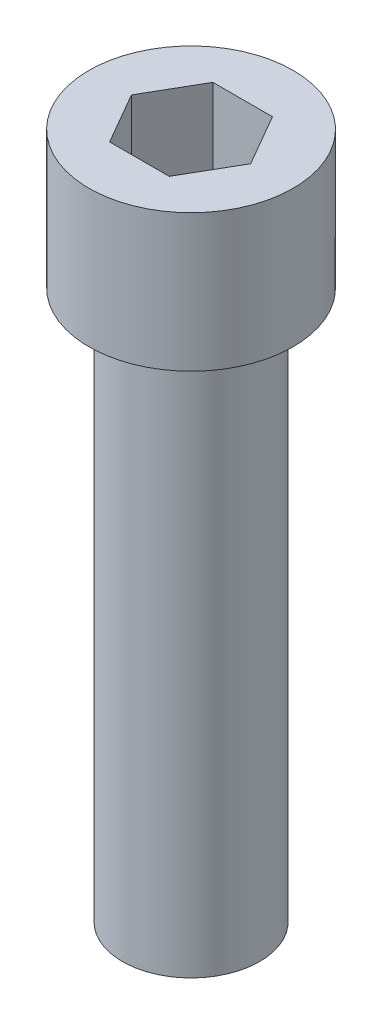
ISO-10303-21;
HEADER;
FILE_DESCRIPTION(('STEP AP214'),'2;1');
FILE_NAME('part.step','',(''),(''),'','','');
FILE_SCHEMA(('AUTOMOTIVE_DESIGN { 1 0 10303 214 1 1 1 1 }'));
ENDSEC;
DATA;
#1=APPLICATION_CONTEXT('core data for automotive mechanical design processes');
#2=APPLICATION_PROTOCOL_DEFINITION('international standard','automotive_design',2000,#1);
#3=PRODUCT_CONTEXT('',#1,'mechanical');
#4=PRODUCT('Part','Part','',(#3));
#5=PRODUCT_RELATED_PRODUCT_CATEGORY('part','',(#4));
#6=PRODUCT_DEFINITION_FORMATION('','',#4);
#7=PRODUCT_DEFINITION_CONTEXT('part definition',#1,'design');
#8=PRODUCT_DEFINITION('design','',#6,#7);
#9=PRODUCT_DEFINITION_SHAPE('','',#8);
#10=(LENGTH_UNIT() NAMED_UNIT(*) SI_UNIT(.MILLI.,.METRE.));
#11=(NAMED_UNIT(*) PLANE_ANGLE_UNIT() SI_UNIT($,.RADIAN.));
#12=(NAMED_UNIT(*) SI_UNIT($,.STERADIAN.) SOLID_ANGLE_UNIT());
#13=UNCERTAINTY_MEASURE_WITH_UNIT(LENGTH_MEASURE(1.E-05),#10,'distance_accuracy_value','');
#14=(GEOMETRIC_REPRESENTATION_CONTEXT(3) GLOBAL_UNCERTAINTY_ASSIGNED_CONTEXT((#13)) GLOBAL_UNIT_ASSIGNED_CONTEXT((#10,
#11,#12)) REPRESENTATION_CONTEXT('',''));
#15=CARTESIAN_POINT('',(0.,0.,0.));
#16=DIRECTION('',(0.,0.,1.));
#17=DIRECTION('',(1.,0.,0.));
#18=AXIS2_PLACEMENT_3D('',#15,#16,#17);
#19=CARTESIAN_POINT('',(0.,31.75,0.));
#20=DIRECTION('',(0.,1.,0.));
#21=DIRECTION('',(0.,0.,1.));
#22=AXIS2_PLACEMENT_3D('',#19,#20,#21);
#23=PLANE('',#22);
#24=DIRECTION('',(0.5,0.,-0.866025403784439));
#25=VECTOR('',#24,1.);
#26=CARTESIAN_POINT('',(1.37848150271715,31.75,2.3876));
#27=LINE('',#26,#25);
#28=CARTESIAN_POINT('',(1.37848150271715,31.75,2.3876));
#29=VERTEX_POINT('',#28);
#30=CARTESIAN_POINT('',(2.7569630054343,31.75,0.));
#31=VERTEX_POINT('',#30);
#32=EDGE_CURVE('E47',#29,#31,#27,.T.);
#33=ORIENTED_EDGE('',*,*,#32,.F.);
#34=DIRECTION('',(1.,0.,0.));
#35=VECTOR('',#34,1.);
#36=CARTESIAN_POINT('',(-1.37848150271715,31.75,2.3876));
#37=LINE('',#36,#35);
#38=CARTESIAN_POINT('',(-1.37848150271715,31.75,2.3876));
#39=VERTEX_POINT('',#38);
#40=EDGE_CURVE('E116',#39,#29,#37,.T.);
#41=ORIENTED_EDGE('',*,*,#40,.F.);
#42=DIRECTION('',(0.5,0.,0.866025403784438));
#43=VECTOR('',#42,1.);
#44=CARTESIAN_POINT('',(-2.7569630054343,31.75,0.));
#45=LINE('',#44,#43);
#46=CARTESIAN_POINT('',(-2.7569630054343,31.75,0.));
#47=VERTEX_POINT('',#46);
#48=EDGE_CURVE('E110',#47,#39,#45,.T.);
#49=ORIENTED_EDGE('',*,*,#48,.F.);
#50=DIRECTION('',(-0.5,0.,0.866025403784439));
#51=VECTOR('',#50,1.);
#52=CARTESIAN_POINT('',(-1.37848150271715,31.75,-2.3876));
#53=LINE('',#52,#51);
#54=CARTESIAN_POINT('',(-1.37848150271715,31.75,-2.3876));
#55=VERTEX_POINT('',#54);
#56=EDGE_CURVE('E108',#55,#47,#53,.T.);
#57=ORIENTED_EDGE('',*,*,#56,.F.);
#58=DIRECTION('',(-1.,0.,0.));
#59=VECTOR('',#58,1.);
#60=CARTESIAN_POINT('',(1.37848150271715,31.75,-2.3876));
#61=LINE('',#60,#59);
#62=CARTESIAN_POINT('',(1.37848150271715,31.75,-2.3876));
#63=VERTEX_POINT('',#62);
#64=EDGE_CURVE('E90',#63,#55,#61,.T.);
#65=ORIENTED_EDGE('',*,*,#64,.F.);
#66=DIRECTION('',(-0.5,0.,-0.866025403784439));
#67=VECTOR('',#66,1.);
#68=CARTESIAN_POINT('',(2.7569630054343,31.75,0.));
#69=LINE('',#68,#67);
#70=EDGE_CURVE('E101',#31,#63,#69,.T.);
#71=ORIENTED_EDGE('',*,*,#70,.F.);
#72=EDGE_LOOP('',(#33,#41,#49,#57,#65,#71));
#73=FACE_BOUND('',#72,.T.);
#74=CARTESIAN_POINT('',(0.,31.75,0.));
#75=DIRECTION('',(0.,-1.,0.));
#76=DIRECTION('',(0.,0.,-1.));
#77=AXIS2_PLACEMENT_3D('',#74,#75,#76);
#78=CIRCLE('',#77,4.7244);
#79=CARTESIAN_POINT('',(0.,31.75,-4.7244));
#80=VERTEX_POINT('',#79);
#81=EDGE_CURVE('E11',#80,#80,#78,.T.);
#82=ORIENTED_EDGE('',*,*,#81,.F.);
#83=EDGE_LOOP('',(#82));
#84=FACE_BOUND('',#83,.T.);
#85=ADVANCED_FACE('F33',(#73,#84),#23,.T.);
#86=CARTESIAN_POINT('',(0.,0.,0.));
#87=DIRECTION('',(0.,-1.,0.));
#88=DIRECTION('',(0.,0.,-1.));
#89=AXIS2_PLACEMENT_3D('',#86,#87,#88);
#90=CYLINDRICAL_SURFACE('',#89,4.7244);
#91=ORIENTED_EDGE('',*,*,#81,.T.);
#92=EDGE_LOOP('',(#91));
#93=FACE_BOUND('',#92,.T.);
#94=CARTESIAN_POINT('',(0.,25.4,0.));
#95=DIRECTION('',(0.,-1.,0.));
#96=DIRECTION('',(0.,0.,-1.));
#97=AXIS2_PLACEMENT_3D('',#94,#95,#96);
#98=CIRCLE('',#97,4.7244);
#99=CARTESIAN_POINT('',(0.,25.4,-4.7244));
#100=VERTEX_POINT('',#99);
#101=EDGE_CURVE('E40',#100,#100,#98,.T.);
#102=ORIENTED_EDGE('',*,*,#101,.F.);
#103=EDGE_LOOP('',(#102));
#104=FACE_BOUND('',#103,.T.);
#105=ADVANCED_FACE('F151',(#93,#104),#90,.T.);
#106=CARTESIAN_POINT('',(3.175,25.4,0.));
#107=DIRECTION('',(0.,-1.,0.));
#108=DIRECTION('',(0.,0.,-1.));
#109=AXIS2_PLACEMENT_3D('',#106,#107,#108);
#110=PLANE('',#109);
#111=ORIENTED_EDGE('',*,*,#101,.T.);
#112=EDGE_LOOP('',(#111));
#113=FACE_BOUND('',#112,.T.);
#114=CARTESIAN_POINT('',(0.,25.4,0.));
#115=DIRECTION('',(0.,-1.,0.));
#116=DIRECTION('',(0.,0.,-1.));
#117=AXIS2_PLACEMENT_3D('',#114,#115,#116);
#118=CIRCLE('',#117,3.175);
#119=CARTESIAN_POINT('',(0.,25.4,-3.175));
#120=VERTEX_POINT('',#119);
#121=EDGE_CURVE('E143',#120,#120,#118,.T.);
#122=ORIENTED_EDGE('',*,*,#121,.F.);
#123=EDGE_LOOP('',(#122));
#124=FACE_BOUND('',#123,.T.);
#125=ADVANCED_FACE('F148',(#113,#124),#110,.T.);
#126=CARTESIAN_POINT('',(0.,0.,0.));
#127=DIRECTION('',(0.,-1.,0.));
#128=DIRECTION('',(0.,0.,-1.));
#129=AXIS2_PLACEMENT_3D('',#126,#127,#128);
#130=CYLINDRICAL_SURFACE('',#129,3.175);
#131=ORIENTED_EDGE('',*,*,#121,.T.);
#132=EDGE_LOOP('',(#131));
#133=FACE_BOUND('',#132,.T.);
#134=CARTESIAN_POINT('',(0.,0.,0.));
#135=DIRECTION('',(0.,-1.,0.));
#136=DIRECTION('',(0.,0.,-1.));
#137=AXIS2_PLACEMENT_3D('',#134,#135,#136);
#138=CIRCLE('',#137,3.175);
#139=CARTESIAN_POINT('',(0.,0.,-3.175));
#140=VERTEX_POINT('',#139);
#141=EDGE_CURVE('E134',#140,#140,#138,.T.);
#142=ORIENTED_EDGE('',*,*,#141,.F.);
#143=EDGE_LOOP('',(#142));
#144=FACE_BOUND('',#143,.T.);
#145=ADVANCED_FACE('F158',(#133,#144),#130,.T.);
#146=CARTESIAN_POINT('',(0.,0.,0.));
#147=DIRECTION('',(0.,-1.,0.));
#148=DIRECTION('',(0.,0.,-1.));
#149=AXIS2_PLACEMENT_3D('',#146,#147,#148);
#150=PLANE('',#149);
#151=ORIENTED_EDGE('',*,*,#141,.T.);
#152=EDGE_LOOP('',(#151));
#153=FACE_BOUND('',#152,.T.);
#154=ADVANCED_FACE('F163',(#153),#150,.T.);
#155=CARTESIAN_POINT('',(1.37848150271715,27.94,2.3876));
#156=DIRECTION('',(0.866025403784439,0.,0.5));
#157=DIRECTION('',(0.5,0.,-0.866025403784439));
#158=AXIS2_PLACEMENT_3D('',#155,#156,#157);
#159=PLANE('',#158);
#160=ORIENTED_EDGE('',*,*,#32,.T.);
#161=DIRECTION('',(0.,1.,0.));
#162=VECTOR('',#161,1.);
#163=CARTESIAN_POINT('',(2.7569630054343,27.94,0.));
#164=LINE('',#163,#162);
#165=CARTESIAN_POINT('',(2.7569630054343,27.94,0.));
#166=VERTEX_POINT('',#165);
#167=EDGE_CURVE('E98',#166,#31,#164,.T.);
#168=ORIENTED_EDGE('',*,*,#167,.F.);
#169=DIRECTION('',(0.5,0.,-0.866025403784439));
#170=VECTOR('',#169,1.);
#171=CARTESIAN_POINT('',(1.37848150271715,27.94,2.3876));
#172=LINE('',#171,#170);
#173=CARTESIAN_POINT('',(1.37848150271715,27.94,2.3876));
#174=VERTEX_POINT('',#173);
#175=EDGE_CURVE('E118',#174,#166,#172,.T.);
#176=ORIENTED_EDGE('',*,*,#175,.F.);
#177=DIRECTION('',(0.,1.,0.));
#178=VECTOR('',#177,1.);
#179=CARTESIAN_POINT('',(1.37848150271715,27.94,2.3876));
#180=LINE('',#179,#178);
#181=EDGE_CURVE('E54',#174,#29,#180,.T.);
#182=ORIENTED_EDGE('',*,*,#181,.T.);
#183=EDGE_LOOP('',(#160,#168,#176,#182));
#184=FACE_BOUND('',#183,.T.);
#185=ADVANCED_FACE('F167',(#184),#159,.F.);
#186=CARTESIAN_POINT('',(-1.37848150271715,27.94,2.3876));
#187=DIRECTION('',(0.,0.,1.));
#188=DIRECTION('',(1.,0.,0.));
#189=AXIS2_PLACEMENT_3D('',#186,#187,#188);
#190=PLANE('',#189);
#191=ORIENTED_EDGE('',*,*,#40,.T.);
#192=ORIENTED_EDGE('',*,*,#181,.F.);
#193=DIRECTION('',(1.,0.,0.));
#194=VECTOR('',#193,1.);
#195=CARTESIAN_POINT('',(-1.37848150271715,27.94,2.3876));
#196=LINE('',#195,#194);
#197=CARTESIAN_POINT('',(-1.37848150271715,27.94,2.3876));
#198=VERTEX_POINT('',#197);
#199=EDGE_CURVE('E130',#198,#174,#196,.T.);
#200=ORIENTED_EDGE('',*,*,#199,.F.);
#201=DIRECTION('',(0.,1.,0.));
#202=VECTOR('',#201,1.);
#203=CARTESIAN_POINT('',(-1.37848150271715,27.94,2.3876));
#204=LINE('',#203,#202);
#205=EDGE_CURVE('E135',#198,#39,#204,.T.);
#206=ORIENTED_EDGE('',*,*,#205,.T.);
#207=EDGE_LOOP('',(#191,#192,#200,#206));
#208=FACE_BOUND('',#207,.T.);
#209=ADVANCED_FACE('F171',(#208),#190,.F.);
#210=CARTESIAN_POINT('',(-2.7569630054343,27.94,0.));
#211=DIRECTION('',(-0.866025403784439,0.,0.5));
#212=DIRECTION('',(0.5,0.,0.866025403784439));
#213=AXIS2_PLACEMENT_3D('',#210,#211,#212);
#214=PLANE('',#213);
#215=ORIENTED_EDGE('',*,*,#48,.T.);
#216=ORIENTED_EDGE('',*,*,#205,.F.);
#217=DIRECTION('',(0.5,0.,0.866025403784438));
#218=VECTOR('',#217,1.);
#219=CARTESIAN_POINT('',(-2.7569630054343,27.94,0.));
#220=LINE('',#219,#218);
#221=CARTESIAN_POINT('',(-2.7569630054343,27.94,0.));
#222=VERTEX_POINT('',#221);
#223=EDGE_CURVE('E127',#222,#198,#220,.T.);
#224=ORIENTED_EDGE('',*,*,#223,.F.);
#225=DIRECTION('',(0.,1.,0.));
#226=VECTOR('',#225,1.);
#227=CARTESIAN_POINT('',(-2.7569630054343,27.94,0.));
#228=LINE('',#227,#226);
#229=EDGE_CURVE('E137',#222,#47,#228,.T.);
#230=ORIENTED_EDGE('',*,*,#229,.T.);
#231=EDGE_LOOP('',(#215,#216,#224,#230));
#232=FACE_BOUND('',#231,.T.);
#233=ADVANCED_FACE('F180',(#232),#214,.F.);
#234=CARTESIAN_POINT('',(-1.37848150271715,27.94,-2.3876));
#235=DIRECTION('',(-0.866025403784439,0.,-0.5));
#236=DIRECTION('',(-0.5,0.,0.866025403784439));
#237=AXIS2_PLACEMENT_3D('',#234,#235,#236);
#238=PLANE('',#237);
#239=ORIENTED_EDGE('',*,*,#56,.T.);
#240=ORIENTED_EDGE('',*,*,#229,.F.);
#241=DIRECTION('',(-0.5,0.,0.866025403784439));
#242=VECTOR('',#241,1.);
#243=CARTESIAN_POINT('',(-1.37848150271715,27.94,-2.3876));
#244=LINE('',#243,#242);
#245=CARTESIAN_POINT('',(-1.37848150271715,27.94,-2.3876));
#246=VERTEX_POINT('',#245);
#247=EDGE_CURVE('E124',#246,#222,#244,.T.);
#248=ORIENTED_EDGE('',*,*,#247,.F.);
#249=DIRECTION('',(0.,1.,0.));
#250=VECTOR('',#249,1.);
#251=CARTESIAN_POINT('',(-1.37848150271715,27.94,-2.3876));
#252=LINE('',#251,#250);
#253=EDGE_CURVE('E97',#246,#55,#252,.T.);
#254=ORIENTED_EDGE('',*,*,#253,.T.);
#255=EDGE_LOOP('',(#239,#240,#248,#254));
#256=FACE_BOUND('',#255,.T.);
#257=ADVANCED_FACE('F177',(#256),#238,.F.);
#258=CARTESIAN_POINT('',(1.37848150271715,27.94,-2.3876));
#259=DIRECTION('',(0.,0.,-1.));
#260=DIRECTION('',(-1.,0.,0.));
#261=AXIS2_PLACEMENT_3D('',#258,#259,#260);
#262=PLANE('',#261);
#263=ORIENTED_EDGE('',*,*,#64,.T.);
#264=ORIENTED_EDGE('',*,*,#253,.F.);
#265=DIRECTION('',(-1.,0.,0.));
#266=VECTOR('',#265,1.);
#267=CARTESIAN_POINT('',(1.37848150271715,27.94,-2.3876));
#268=LINE('',#267,#266);
#269=CARTESIAN_POINT('',(1.37848150271715,27.94,-2.3876));
#270=VERTEX_POINT('',#269);
#271=EDGE_CURVE('E93',#270,#246,#268,.T.);
#272=ORIENTED_EDGE('',*,*,#271,.F.);
#273=DIRECTION('',(0.,1.,0.));
#274=VECTOR('',#273,1.);
#275=CARTESIAN_POINT('',(1.37848150271715,27.94,-2.3876));
#276=LINE('',#275,#274);
#277=EDGE_CURVE('E86',#270,#63,#276,.T.);
#278=ORIENTED_EDGE('',*,*,#277,.T.);
#279=EDGE_LOOP('',(#263,#264,#272,#278));
#280=FACE_BOUND('',#279,.T.);
#281=ADVANCED_FACE('F88',(#280),#262,.F.);
#282=CARTESIAN_POINT('',(2.7569630054343,27.94,0.));
#283=DIRECTION('',(0.866025403784439,0.,-0.5));
#284=DIRECTION('',(-0.5,0.,-0.866025403784439));
#285=AXIS2_PLACEMENT_3D('',#282,#283,#284);
#286=PLANE('',#285);
#287=ORIENTED_EDGE('',*,*,#70,.T.);
#288=ORIENTED_EDGE('',*,*,#277,.F.);
#289=DIRECTION('',(-0.5,0.,-0.866025403784439));
#290=VECTOR('',#289,1.);
#291=CARTESIAN_POINT('',(2.7569630054343,27.94,0.));
#292=LINE('',#291,#290);
#293=EDGE_CURVE('E121',#166,#270,#292,.T.);
#294=ORIENTED_EDGE('',*,*,#293,.F.);
#295=ORIENTED_EDGE('',*,*,#167,.T.);
#296=EDGE_LOOP('',(#287,#288,#294,#295));
#297=FACE_BOUND('',#296,.T.);
#298=ADVANCED_FACE('F102',(#297),#286,.F.);
#299=CARTESIAN_POINT('',(1.37848150271715,27.94,2.3876));
#300=DIRECTION('',(0.,-1.,0.));
#301=DIRECTION('',(0.,0.,-1.));
#302=AXIS2_PLACEMENT_3D('',#299,#300,#301);
#303=PLANE('',#302);
#304=ORIENTED_EDGE('',*,*,#175,.T.);
#305=ORIENTED_EDGE('',*,*,#293,.T.);
#306=ORIENTED_EDGE('',*,*,#271,.T.);
#307=ORIENTED_EDGE('',*,*,#247,.T.);
#308=ORIENTED_EDGE('',*,*,#223,.T.);
#309=ORIENTED_EDGE('',*,*,#199,.T.);
#310=EDGE_LOOP('',(#304,#305,#306,#307,#308,#309));
#311=FACE_BOUND('',#310,.T.);
#312=ADVANCED_FACE('F174',(#311),#303,.F.);
#313=CLOSED_SHELL('',(#85,#105,#125,#145,#154,#185,#209,#233,#257,#281,#298,#312));
#314=MANIFOLD_SOLID_BREP('B2',#313);
#315=ADVANCED_BREP_SHAPE_REPRESENTATION('',(#18,#314),#14);
#316=SHAPE_DEFINITION_REPRESENTATION(#9,#315);
ENDSEC;
END-ISO-10303-21;
